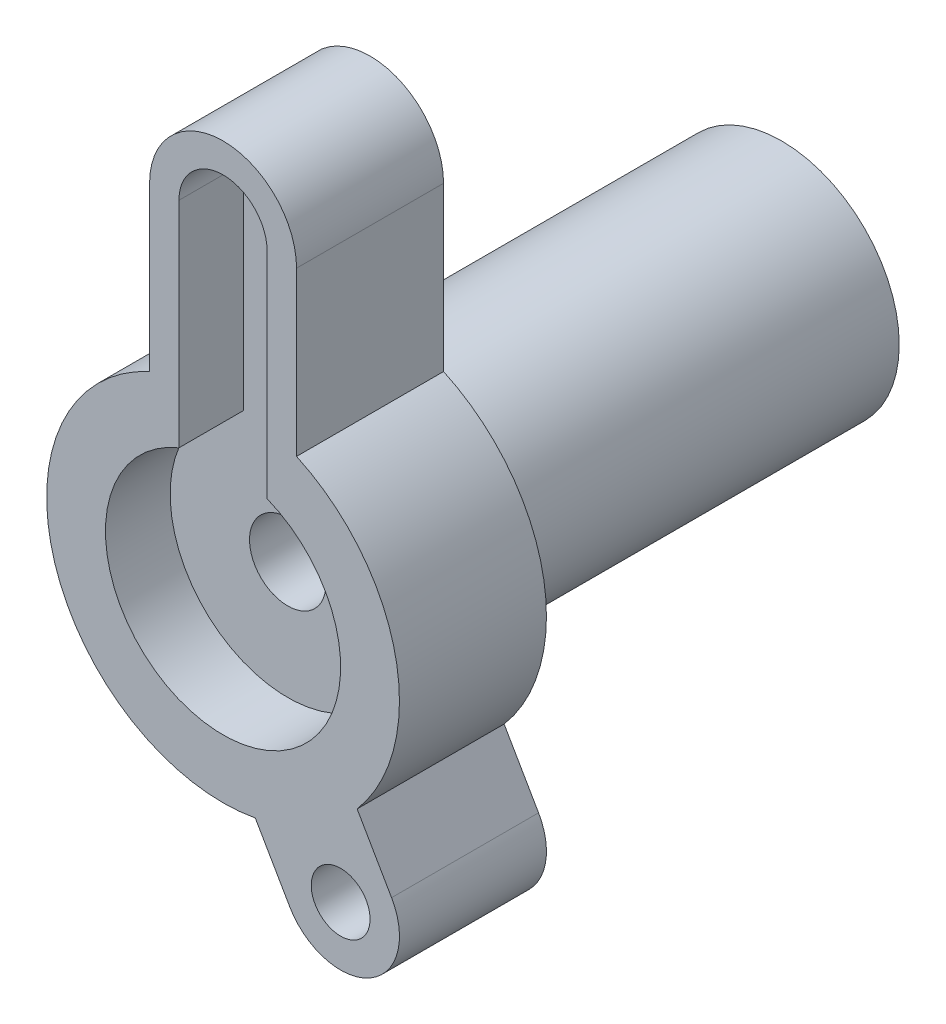
ISO-10303-21;
HEADER;
FILE_DESCRIPTION(('STEP AP214'),'2;1');
FILE_NAME('part.step','',(''),(''),'','','');
FILE_SCHEMA(('AUTOMOTIVE_DESIGN { 1 0 10303 214 1 1 1 1 }'));
ENDSEC;
DATA;
#1=APPLICATION_CONTEXT('core data for automotive mechanical design processes');
#2=APPLICATION_PROTOCOL_DEFINITION('international standard','automotive_design',2000,#1);
#3=PRODUCT_CONTEXT('',#1,'mechanical');
#4=PRODUCT('Part','Part','',(#3));
#5=PRODUCT_RELATED_PRODUCT_CATEGORY('part','',(#4));
#6=PRODUCT_DEFINITION_FORMATION('','',#4);
#7=PRODUCT_DEFINITION_CONTEXT('part definition',#1,'design');
#8=PRODUCT_DEFINITION('design','',#6,#7);
#9=PRODUCT_DEFINITION_SHAPE('','',#8);
#10=(LENGTH_UNIT() NAMED_UNIT(*) SI_UNIT(.MILLI.,.METRE.));
#11=(NAMED_UNIT(*) PLANE_ANGLE_UNIT() SI_UNIT($,.RADIAN.));
#12=(NAMED_UNIT(*) SI_UNIT($,.STERADIAN.) SOLID_ANGLE_UNIT());
#13=UNCERTAINTY_MEASURE_WITH_UNIT(LENGTH_MEASURE(1.E-05),#10,'distance_accuracy_value','');
#14=(GEOMETRIC_REPRESENTATION_CONTEXT(3) GLOBAL_UNCERTAINTY_ASSIGNED_CONTEXT((#13)) GLOBAL_UNIT_ASSIGNED_CONTEXT((#10,
#11,#12)) REPRESENTATION_CONTEXT('',''));
#15=CARTESIAN_POINT('',(0.,0.,0.));
#16=DIRECTION('',(0.,0.,1.));
#17=DIRECTION('',(1.,0.,0.));
#18=AXIS2_PLACEMENT_3D('',#15,#16,#17);
#19=CARTESIAN_POINT('',(0.,0.,71.));
#20=DIRECTION('',(0.,0.,-1.));
#21=DIRECTION('',(-1.,0.,0.));
#22=AXIS2_PLACEMENT_3D('',#19,#20,#21);
#23=CYLINDRICAL_SURFACE('',#22,30.);
#24=DIRECTION('',(0.,0.,1.));
#25=VECTOR('',#24,1.);
#26=CARTESIAN_POINT('',(22.8023896615754,-19.4948974278318,34.8792736773975));
#27=LINE('',#26,#25);
#28=CARTESIAN_POINT('',(22.8023896615754,-19.4948974278318,70.));
#29=VERTEX_POINT('',#28);
#30=CARTESIAN_POINT('',(22.8023896615754,-19.4948974278318,95.));
#31=VERTEX_POINT('',#30);
#32=EDGE_CURVE('E158',#29,#31,#27,.T.);
#33=ORIENTED_EDGE('',*,*,#32,.F.);
#34=CARTESIAN_POINT('',(0.,0.,70.));
#35=DIRECTION('',(0.,0.,1.));
#36=DIRECTION('',(1.,0.,0.));
#37=AXIS2_PLACEMENT_3D('',#34,#35,#36);
#38=CIRCLE('',#37,30.);
#39=CARTESIAN_POINT('',(12.5,27.2717802865893,70.));
#40=VERTEX_POINT('',#39);
#41=EDGE_CURVE('E212',#29,#40,#38,.T.);
#42=ORIENTED_EDGE('',*,*,#41,.T.);
#43=DIRECTION('',(0.,0.,-1.));
#44=VECTOR('',#43,1.);
#45=CARTESIAN_POINT('',(12.5,27.2717802865893,71.));
#46=LINE('',#45,#44);
#47=CARTESIAN_POINT('',(12.5,27.2717802865893,95.));
#48=VERTEX_POINT('',#47);
#49=EDGE_CURVE('E226',#48,#40,#46,.T.);
#50=ORIENTED_EDGE('',*,*,#49,.F.);
#51=CARTESIAN_POINT('',(0.,0.,95.));
#52=DIRECTION('',(0.,0.,1.));
#53=DIRECTION('',(1.,0.,0.));
#54=AXIS2_PLACEMENT_3D('',#51,#52,#53);
#55=CIRCLE('',#54,30.);
#56=EDGE_CURVE('E187',#31,#48,#55,.T.);
#57=ORIENTED_EDGE('',*,*,#56,.F.);
#58=EDGE_LOOP('',(#33,#42,#50,#57));
#59=FACE_BOUND('',#58,.T.);
#60=ADVANCED_FACE('F37',(#59),#23,.T.);
#61=CARTESIAN_POINT('',(0.,0.,0.));
#62=DIRECTION('',(0.,0.,1.));
#63=DIRECTION('',(1.,0.,0.));
#64=AXIS2_PLACEMENT_3D('',#61,#62,#63);
#65=PLANE('',#64);
#66=CARTESIAN_POINT('',(0.,0.,0.));
#67=DIRECTION('',(0.,0.,1.));
#68=DIRECTION('',(1.,0.,0.));
#69=AXIS2_PLACEMENT_3D('',#66,#67,#68);
#70=CIRCLE('',#69,20.);
#71=CARTESIAN_POINT('',(20.,0.,0.));
#72=VERTEX_POINT('',#71);
#73=EDGE_CURVE('E41',#72,#72,#70,.T.);
#74=ORIENTED_EDGE('',*,*,#73,.F.);
#75=EDGE_LOOP('',(#74));
#76=FACE_BOUND('',#75,.T.);
#77=CARTESIAN_POINT('',(0.,0.,0.));
#78=DIRECTION('',(0.,0.,1.));
#79=DIRECTION('',(1.,0.,0.));
#80=AXIS2_PLACEMENT_3D('',#77,#78,#79);
#81=CIRCLE('',#80,6.5);
#82=CARTESIAN_POINT('',(6.5,0.,0.));
#83=VERTEX_POINT('',#82);
#84=EDGE_CURVE('E231',#83,#83,#81,.T.);
#85=ORIENTED_EDGE('',*,*,#84,.T.);
#86=EDGE_LOOP('',(#85));
#87=FACE_BOUND('',#86,.T.);
#88=ADVANCED_FACE('F239',(#76,#87),#65,.F.);
#89=CARTESIAN_POINT('',(0.,0.,70.));
#90=DIRECTION('',(0.,0.,-1.));
#91=DIRECTION('',(-1.,0.,0.));
#92=AXIS2_PLACEMENT_3D('',#89,#90,#91);
#93=CYLINDRICAL_SURFACE('',#92,20.);
#94=CARTESIAN_POINT('',(0.,0.,70.));
#95=DIRECTION('',(0.,0.,1.));
#96=DIRECTION('',(1.,0.,0.));
#97=AXIS2_PLACEMENT_3D('',#94,#95,#96);
#98=CIRCLE('',#97,20.);
#99=CARTESIAN_POINT('',(20.,0.,70.));
#100=VERTEX_POINT('',#99);
#101=EDGE_CURVE('E11',#100,#100,#98,.T.);
#102=ORIENTED_EDGE('',*,*,#101,.F.);
#103=EDGE_LOOP('',(#102));
#104=FACE_BOUND('',#103,.T.);
#105=ORIENTED_EDGE('',*,*,#73,.T.);
#106=EDGE_LOOP('',(#105));
#107=FACE_BOUND('',#106,.T.);
#108=ADVANCED_FACE('F39',(#104,#107),#93,.T.);
#109=CARTESIAN_POINT('',(0.,0.,70.));
#110=DIRECTION('',(0.,0.,-1.));
#111=DIRECTION('',(-1.,0.,0.));
#112=AXIS2_PLACEMENT_3D('',#109,#110,#111);
#113=CYLINDRICAL_SURFACE('',#112,6.5);
#114=ORIENTED_EDGE('',*,*,#84,.F.);
#115=EDGE_LOOP('',(#114));
#116=FACE_BOUND('',#115,.T.);
#117=CARTESIAN_POINT('',(0.,0.,84.));
#118=DIRECTION('',(0.,0.,1.));
#119=DIRECTION('',(1.,0.,0.));
#120=AXIS2_PLACEMENT_3D('',#117,#118,#119);
#121=CIRCLE('',#120,6.5);
#122=CARTESIAN_POINT('',(6.5,0.,84.));
#123=VERTEX_POINT('',#122);
#124=EDGE_CURVE('E148',#123,#123,#121,.T.);
#125=ORIENTED_EDGE('',*,*,#124,.T.);
#126=EDGE_LOOP('',(#125));
#127=FACE_BOUND('',#126,.T.);
#128=ADVANCED_FACE('F245',(#116,#127),#113,.F.);
#129=CARTESIAN_POINT('',(0.,0.,70.));
#130=DIRECTION('',(0.,0.,1.));
#131=DIRECTION('',(1.,0.,0.));
#132=AXIS2_PLACEMENT_3D('',#129,#130,#131);
#133=PLANE('',#132);
#134=ORIENTED_EDGE('',*,*,#101,.T.);
#135=EDGE_LOOP('',(#134));
#136=FACE_BOUND('',#135,.T.);
#137=DIRECTION('',(0.,1.,0.));
#138=VECTOR('',#137,1.);
#139=CARTESIAN_POINT('',(-12.5,0.,70.));
#140=LINE('',#139,#138);
#141=CARTESIAN_POINT('',(-12.5,27.2717802865893,70.));
#142=VERTEX_POINT('',#141);
#143=CARTESIAN_POINT('',(-12.5,55.,70.));
#144=VERTEX_POINT('',#143);
#145=EDGE_CURVE('E209',#142,#144,#140,.T.);
#146=ORIENTED_EDGE('',*,*,#145,.T.);
#147=CARTESIAN_POINT('',(0.,55.,70.));
#148=DIRECTION('',(0.,0.,1.));
#149=DIRECTION('',(1.,0.,0.));
#150=AXIS2_PLACEMENT_3D('',#147,#148,#149);
#151=CIRCLE('',#150,12.5);
#152=CARTESIAN_POINT('',(12.5,55.,70.));
#153=VERTEX_POINT('',#152);
#154=EDGE_CURVE('E218',#153,#144,#151,.T.);
#155=ORIENTED_EDGE('',*,*,#154,.F.);
#156=DIRECTION('',(0.,1.,0.));
#157=VECTOR('',#156,1.);
#158=CARTESIAN_POINT('',(12.5,0.,70.));
#159=LINE('',#158,#157);
#160=EDGE_CURVE('E216',#40,#153,#159,.T.);
#161=ORIENTED_EDGE('',*,*,#160,.F.);
#162=ORIENTED_EDGE('',*,*,#41,.F.);
#163=DIRECTION('',(-0.500000000000001,0.866025403784438,0.));
#164=VECTOR('',#163,1.);
#165=CARTESIAN_POINT('',(8.66025403784437,5.00000000000001,70.));
#166=LINE('',#165,#164);
#167=CARTESIAN_POINT('',(28.6602540378444,-29.6410161513775,70.));
#168=VERTEX_POINT('',#167);
#169=EDGE_CURVE('E178',#168,#29,#166,.T.);
#170=ORIENTED_EDGE('',*,*,#169,.F.);
#171=CARTESIAN_POINT('',(20.0000000000001,-34.6410161513775,70.));
#172=DIRECTION('',(0.,0.,1.));
#173=DIRECTION('',(1.,0.,0.));
#174=AXIS2_PLACEMENT_3D('',#171,#172,#173);
#175=CIRCLE('',#174,9.99999999999998);
#176=CARTESIAN_POINT('',(11.3397459621557,-39.6410161513775,70.));
#177=VERTEX_POINT('',#176);
#178=EDGE_CURVE('E172',#168,#177,#175,.F.);
#179=ORIENTED_EDGE('',*,*,#178,.T.);
#180=DIRECTION('',(-0.500000000000001,0.866025403784438,0.));
#181=VECTOR('',#180,1.);
#182=CARTESIAN_POINT('',(-8.66025403784436,-5.00000000000001,70.));
#183=LINE('',#182,#181);
#184=CARTESIAN_POINT('',(5.48188158588663,-29.4948974278318,70.));
#185=VERTEX_POINT('',#184);
#186=EDGE_CURVE('E162',#177,#185,#183,.T.);
#187=ORIENTED_EDGE('',*,*,#186,.T.);
#188=EDGE_CURVE('E213',#142,#185,#38,.T.);
#189=ORIENTED_EDGE('',*,*,#188,.F.);
#190=EDGE_LOOP('',(#146,#155,#161,#162,#170,#179,#187,#189));
#191=FACE_BOUND('',#190,.T.);
#192=CARTESIAN_POINT('',(20.0000000000001,-34.6410161513775,70.));
#193=DIRECTION('',(0.,0.,1.));
#194=DIRECTION('',(1.,0.,0.));
#195=AXIS2_PLACEMENT_3D('',#192,#193,#194);
#196=CIRCLE('',#195,5.);
#197=CARTESIAN_POINT('',(25.0000000000001,-34.6410161513775,70.));
#198=VERTEX_POINT('',#197);
#199=EDGE_CURVE('E157',#198,#198,#196,.F.);
#200=ORIENTED_EDGE('',*,*,#199,.F.);
#201=EDGE_LOOP('',(#200));
#202=FACE_BOUND('',#201,.T.);
#203=ADVANCED_FACE('F253',(#136,#191,#202),#133,.F.);
#204=CARTESIAN_POINT('',(-12.5,0.,71.));
#205=DIRECTION('',(-1.,0.,0.));
#206=DIRECTION('',(0.,0.,1.));
#207=AXIS2_PLACEMENT_3D('',#204,#205,#206);
#208=PLANE('',#207);
#209=ORIENTED_EDGE('',*,*,#145,.F.);
#210=DIRECTION('',(0.,0.,-1.));
#211=VECTOR('',#210,1.);
#212=CARTESIAN_POINT('',(-12.5,27.2717802865893,71.));
#213=LINE('',#212,#211);
#214=CARTESIAN_POINT('',(-12.5,27.2717802865893,95.));
#215=VERTEX_POINT('',#214);
#216=EDGE_CURVE('E229',#215,#142,#213,.T.);
#217=ORIENTED_EDGE('',*,*,#216,.F.);
#218=DIRECTION('',(0.,1.,0.));
#219=VECTOR('',#218,1.);
#220=CARTESIAN_POINT('',(-12.5,0.,95.));
#221=LINE('',#220,#219);
#222=CARTESIAN_POINT('',(-12.5,55.,95.));
#223=VERTEX_POINT('',#222);
#224=EDGE_CURVE('E174',#215,#223,#221,.T.);
#225=ORIENTED_EDGE('',*,*,#224,.T.);
#226=DIRECTION('',(0.,0.,-1.));
#227=VECTOR('',#226,1.);
#228=CARTESIAN_POINT('',(-12.5,55.,71.));
#229=LINE('',#228,#227);
#230=EDGE_CURVE('E221',#223,#144,#229,.T.);
#231=ORIENTED_EDGE('',*,*,#230,.T.);
#232=EDGE_LOOP('',(#209,#217,#225,#231));
#233=FACE_BOUND('',#232,.T.);
#234=ADVANCED_FACE('F255',(#233),#208,.T.);
#235=ORIENTED_EDGE('',*,*,#188,.T.);
#236=DIRECTION('',(0.,0.,1.));
#237=VECTOR('',#236,1.);
#238=CARTESIAN_POINT('',(5.48188158588663,-29.4948974278318,34.8792736773975));
#239=LINE('',#238,#237);
#240=CARTESIAN_POINT('',(5.48188158588663,-29.4948974278318,95.));
#241=VERTEX_POINT('',#240);
#242=EDGE_CURVE('E175',#185,#241,#239,.T.);
#243=ORIENTED_EDGE('',*,*,#242,.T.);
#244=EDGE_CURVE('E188',#215,#241,#55,.T.);
#245=ORIENTED_EDGE('',*,*,#244,.F.);
#246=ORIENTED_EDGE('',*,*,#216,.T.);
#247=EDGE_LOOP('',(#235,#243,#245,#246));
#248=FACE_BOUND('',#247,.T.);
#249=ADVANCED_FACE('F249',(#248),#23,.T.);
#250=CARTESIAN_POINT('',(12.5,0.,71.));
#251=DIRECTION('',(-1.,0.,0.));
#252=DIRECTION('',(0.,0.,1.));
#253=AXIS2_PLACEMENT_3D('',#250,#251,#252);
#254=PLANE('',#253);
#255=ORIENTED_EDGE('',*,*,#160,.T.);
#256=DIRECTION('',(0.,0.,-1.));
#257=VECTOR('',#256,1.);
#258=CARTESIAN_POINT('',(12.5,55.,71.));
#259=LINE('',#258,#257);
#260=CARTESIAN_POINT('',(12.5,55.,95.));
#261=VERTEX_POINT('',#260);
#262=EDGE_CURVE('E223',#261,#153,#259,.T.);
#263=ORIENTED_EDGE('',*,*,#262,.F.);
#264=DIRECTION('',(0.,1.,0.));
#265=VECTOR('',#264,1.);
#266=CARTESIAN_POINT('',(12.5,0.,95.));
#267=LINE('',#266,#265);
#268=EDGE_CURVE('E191',#48,#261,#267,.T.);
#269=ORIENTED_EDGE('',*,*,#268,.F.);
#270=ORIENTED_EDGE('',*,*,#49,.T.);
#271=EDGE_LOOP('',(#255,#263,#269,#270));
#272=FACE_BOUND('',#271,.T.);
#273=ADVANCED_FACE('F260',(#272),#254,.F.);
#274=CARTESIAN_POINT('',(0.,55.,71.));
#275=DIRECTION('',(0.,0.,-1.));
#276=DIRECTION('',(-1.,0.,0.));
#277=AXIS2_PLACEMENT_3D('',#274,#275,#276);
#278=CYLINDRICAL_SURFACE('',#277,12.5);
#279=ORIENTED_EDGE('',*,*,#154,.T.);
#280=ORIENTED_EDGE('',*,*,#230,.F.);
#281=CARTESIAN_POINT('',(0.,55.,95.));
#282=DIRECTION('',(0.,0.,1.));
#283=DIRECTION('',(1.,0.,0.));
#284=AXIS2_PLACEMENT_3D('',#281,#282,#283);
#285=CIRCLE('',#284,12.5);
#286=EDGE_CURVE('E194',#261,#223,#285,.T.);
#287=ORIENTED_EDGE('',*,*,#286,.F.);
#288=ORIENTED_EDGE('',*,*,#262,.T.);
#289=EDGE_LOOP('',(#279,#280,#287,#288));
#290=FACE_BOUND('',#289,.T.);
#291=ADVANCED_FACE('F264',(#290),#278,.T.);
#292=CARTESIAN_POINT('',(0.,0.,95.));
#293=DIRECTION('',(0.,0.,-1.));
#294=DIRECTION('',(-1.,0.,0.));
#295=AXIS2_PLACEMENT_3D('',#292,#293,#294);
#296=CYLINDRICAL_SURFACE('',#295,20.);
#297=CARTESIAN_POINT('',(0.,0.,84.));
#298=DIRECTION('',(0.,0.,1.));
#299=DIRECTION('',(1.,0.,0.));
#300=AXIS2_PLACEMENT_3D('',#297,#298,#299);
#301=CIRCLE('',#300,20.);
#302=CARTESIAN_POINT('',(-7.5,18.5404962177392,84.));
#303=VERTEX_POINT('',#302);
#304=CARTESIAN_POINT('',(7.5,18.5404962177392,84.));
#305=VERTEX_POINT('',#304);
#306=EDGE_CURVE('E52',#303,#305,#301,.T.);
#307=ORIENTED_EDGE('',*,*,#306,.F.);
#308=DIRECTION('',(0.,0.,-1.));
#309=VECTOR('',#308,1.);
#310=CARTESIAN_POINT('',(-7.5,18.5404962177392,95.));
#311=LINE('',#310,#309);
#312=CARTESIAN_POINT('',(-7.5,18.5404962177392,95.));
#313=VERTEX_POINT('',#312);
#314=EDGE_CURVE('E207',#313,#303,#311,.T.);
#315=ORIENTED_EDGE('',*,*,#314,.F.);
#316=CARTESIAN_POINT('',(0.,0.,95.));
#317=DIRECTION('',(0.,0.,1.));
#318=DIRECTION('',(1.,0.,0.));
#319=AXIS2_PLACEMENT_3D('',#316,#317,#318);
#320=CIRCLE('',#319,20.);
#321=CARTESIAN_POINT('',(7.5,18.5404962177392,95.));
#322=VERTEX_POINT('',#321);
#323=EDGE_CURVE('E197',#313,#322,#320,.T.);
#324=ORIENTED_EDGE('',*,*,#323,.T.);
#325=DIRECTION('',(0.,0.,-1.));
#326=VECTOR('',#325,1.);
#327=CARTESIAN_POINT('',(7.5,18.5404962177392,95.));
#328=LINE('',#327,#326);
#329=EDGE_CURVE('E138',#322,#305,#328,.T.);
#330=ORIENTED_EDGE('',*,*,#329,.T.);
#331=EDGE_LOOP('',(#307,#315,#324,#330));
#332=FACE_BOUND('',#331,.T.);
#333=ADVANCED_FACE('F268',(#332),#296,.F.);
#334=CARTESIAN_POINT('',(-7.5,0.,95.));
#335=DIRECTION('',(-1.,0.,0.));
#336=DIRECTION('',(0.,0.,1.));
#337=AXIS2_PLACEMENT_3D('',#334,#335,#336);
#338=PLANE('',#337);
#339=ORIENTED_EDGE('',*,*,#314,.T.);
#340=DIRECTION('',(0.,-1.,0.));
#341=VECTOR('',#340,1.);
#342=CARTESIAN_POINT('',(-7.5,55.,84.));
#343=LINE('',#342,#341);
#344=CARTESIAN_POINT('',(-7.5,55.,84.));
#345=VERTEX_POINT('',#344);
#346=EDGE_CURVE('E59',#345,#303,#343,.T.);
#347=ORIENTED_EDGE('',*,*,#346,.F.);
#348=DIRECTION('',(0.,0.,-1.));
#349=VECTOR('',#348,1.);
#350=CARTESIAN_POINT('',(-7.5,55.,95.));
#351=LINE('',#350,#349);
#352=CARTESIAN_POINT('',(-7.5,55.,95.));
#353=VERTEX_POINT('',#352);
#354=EDGE_CURVE('E137',#353,#345,#351,.T.);
#355=ORIENTED_EDGE('',*,*,#354,.F.);
#356=DIRECTION('',(0.,1.,0.));
#357=VECTOR('',#356,1.);
#358=CARTESIAN_POINT('',(-7.5,0.,95.));
#359=LINE('',#358,#357);
#360=EDGE_CURVE('E200',#313,#353,#359,.T.);
#361=ORIENTED_EDGE('',*,*,#360,.F.);
#362=EDGE_LOOP('',(#339,#347,#355,#361));
#363=FACE_BOUND('',#362,.T.);
#364=ADVANCED_FACE('F275',(#363),#338,.F.);
#365=CARTESIAN_POINT('',(0.,55.,95.));
#366=DIRECTION('',(0.,0.,-1.));
#367=DIRECTION('',(-1.,0.,0.));
#368=AXIS2_PLACEMENT_3D('',#365,#366,#367);
#369=CYLINDRICAL_SURFACE('',#368,7.5);
#370=CARTESIAN_POINT('',(0.,55.,84.));
#371=DIRECTION('',(0.,0.,1.));
#372=DIRECTION('',(1.,0.,0.));
#373=AXIS2_PLACEMENT_3D('',#370,#371,#372);
#374=CIRCLE('',#373,7.5);
#375=CARTESIAN_POINT('',(7.5,55.,84.));
#376=VERTEX_POINT('',#375);
#377=EDGE_CURVE('E141',#376,#345,#374,.T.);
#378=ORIENTED_EDGE('',*,*,#377,.F.);
#379=DIRECTION('',(0.,0.,-1.));
#380=VECTOR('',#379,1.);
#381=CARTESIAN_POINT('',(7.5,55.,95.));
#382=LINE('',#381,#380);
#383=CARTESIAN_POINT('',(7.5,55.,95.));
#384=VERTEX_POINT('',#383);
#385=EDGE_CURVE('E127',#384,#376,#382,.T.);
#386=ORIENTED_EDGE('',*,*,#385,.F.);
#387=CARTESIAN_POINT('',(0.,55.,95.));
#388=DIRECTION('',(0.,0.,1.));
#389=DIRECTION('',(1.,0.,0.));
#390=AXIS2_PLACEMENT_3D('',#387,#388,#389);
#391=CIRCLE('',#390,7.5);
#392=EDGE_CURVE('E202',#384,#353,#391,.T.);
#393=ORIENTED_EDGE('',*,*,#392,.T.);
#394=ORIENTED_EDGE('',*,*,#354,.T.);
#395=EDGE_LOOP('',(#378,#386,#393,#394));
#396=FACE_BOUND('',#395,.T.);
#397=ADVANCED_FACE('F142',(#396),#369,.F.);
#398=CARTESIAN_POINT('',(7.5,0.,95.));
#399=DIRECTION('',(-1.,0.,0.));
#400=DIRECTION('',(0.,-1.,0.));
#401=AXIS2_PLACEMENT_3D('',#398,#399,#400);
#402=PLANE('',#401);
#403=DIRECTION('',(0.,1.,0.));
#404=VECTOR('',#403,1.);
#405=CARTESIAN_POINT('',(7.5,18.5404962177392,84.));
#406=LINE('',#405,#404);
#407=EDGE_CURVE('E131',#305,#376,#406,.T.);
#408=ORIENTED_EDGE('',*,*,#407,.F.);
#409=ORIENTED_EDGE('',*,*,#329,.F.);
#410=DIRECTION('',(0.,1.,0.));
#411=VECTOR('',#410,1.);
#412=CARTESIAN_POINT('',(7.5,0.,95.));
#413=LINE('',#412,#411);
#414=EDGE_CURVE('E133',#322,#384,#413,.T.);
#415=ORIENTED_EDGE('',*,*,#414,.T.);
#416=ORIENTED_EDGE('',*,*,#385,.T.);
#417=EDGE_LOOP('',(#408,#409,#415,#416));
#418=FACE_BOUND('',#417,.T.);
#419=ADVANCED_FACE('F129',(#418),#402,.T.);
#420=CARTESIAN_POINT('',(0.,0.,95.));
#421=DIRECTION('',(0.,0.,1.));
#422=DIRECTION('',(1.,0.,0.));
#423=AXIS2_PLACEMENT_3D('',#420,#421,#422);
#424=PLANE('',#423);
#425=ORIENTED_EDGE('',*,*,#224,.F.);
#426=ORIENTED_EDGE('',*,*,#244,.T.);
#427=DIRECTION('',(0.500000000000001,-0.866025403784438,0.));
#428=VECTOR('',#427,1.);
#429=CARTESIAN_POINT('',(-8.66025403784436,-5.00000000000001,95.));
#430=LINE('',#429,#428);
#431=CARTESIAN_POINT('',(11.3397459621557,-39.6410161513775,95.));
#432=VERTEX_POINT('',#431);
#433=EDGE_CURVE('E163',#241,#432,#430,.T.);
#434=ORIENTED_EDGE('',*,*,#433,.T.);
#435=CARTESIAN_POINT('',(20.0000000000001,-34.6410161513775,95.));
#436=DIRECTION('',(0.,0.,1.));
#437=DIRECTION('',(1.,0.,0.));
#438=AXIS2_PLACEMENT_3D('',#435,#436,#437);
#439=CIRCLE('',#438,9.99999999999998);
#440=CARTESIAN_POINT('',(28.6602540378444,-29.6410161513775,95.));
#441=VERTEX_POINT('',#440);
#442=EDGE_CURVE('E159',#432,#441,#439,.T.);
#443=ORIENTED_EDGE('',*,*,#442,.T.);
#444=DIRECTION('',(0.500000000000001,-0.866025403784438,0.));
#445=VECTOR('',#444,1.);
#446=CARTESIAN_POINT('',(8.66025403784437,5.00000000000001,95.));
#447=LINE('',#446,#445);
#448=EDGE_CURVE('E154',#31,#441,#447,.T.);
#449=ORIENTED_EDGE('',*,*,#448,.F.);
#450=ORIENTED_EDGE('',*,*,#56,.T.);
#451=ORIENTED_EDGE('',*,*,#268,.T.);
#452=ORIENTED_EDGE('',*,*,#286,.T.);
#453=EDGE_LOOP('',(#425,#426,#434,#443,#449,#450,#451,#452));
#454=FACE_BOUND('',#453,.T.);
#455=ORIENTED_EDGE('',*,*,#323,.F.);
#456=ORIENTED_EDGE('',*,*,#360,.T.);
#457=ORIENTED_EDGE('',*,*,#392,.F.);
#458=ORIENTED_EDGE('',*,*,#414,.F.);
#459=EDGE_LOOP('',(#455,#456,#457,#458));
#460=FACE_BOUND('',#459,.T.);
#461=CARTESIAN_POINT('',(20.0000000000001,-34.6410161513775,95.));
#462=DIRECTION('',(0.,0.,1.));
#463=DIRECTION('',(1.,0.,0.));
#464=AXIS2_PLACEMENT_3D('',#461,#462,#463);
#465=CIRCLE('',#464,5.);
#466=CARTESIAN_POINT('',(25.0000000000001,-34.6410161513775,95.));
#467=VERTEX_POINT('',#466);
#468=EDGE_CURVE('E167',#467,#467,#465,.T.);
#469=ORIENTED_EDGE('',*,*,#468,.F.);
#470=EDGE_LOOP('',(#469));
#471=FACE_BOUND('',#470,.T.);
#472=ADVANCED_FACE('F282',(#454,#460,#471),#424,.T.);
#473=CARTESIAN_POINT('',(-8.66025403784436,-5.00000000000001,34.8792736773975));
#474=DIRECTION('',(-0.866025403784438,-0.500000000000001,0.));
#475=DIRECTION('',(0.500000000000001,-0.866025403784438,0.));
#476=AXIS2_PLACEMENT_3D('',#473,#474,#475);
#477=PLANE('',#476);
#478=ORIENTED_EDGE('',*,*,#186,.F.);
#479=DIRECTION('',(0.,0.,1.));
#480=VECTOR('',#479,1.);
#481=CARTESIAN_POINT('',(11.3397459621557,-39.6410161513775,34.8792736773975));
#482=LINE('',#481,#480);
#483=EDGE_CURVE('E153',#177,#432,#482,.T.);
#484=ORIENTED_EDGE('',*,*,#483,.T.);
#485=ORIENTED_EDGE('',*,*,#433,.F.);
#486=ORIENTED_EDGE('',*,*,#242,.F.);
#487=EDGE_LOOP('',(#478,#484,#485,#486));
#488=FACE_BOUND('',#487,.T.);
#489=ADVANCED_FACE('F285',(#488),#477,.T.);
#490=CARTESIAN_POINT('',(8.66025403784437,5.00000000000001,34.8792736773975));
#491=DIRECTION('',(-0.866025403784438,-0.500000000000001,0.));
#492=DIRECTION('',(0.500000000000001,-0.866025403784438,0.));
#493=AXIS2_PLACEMENT_3D('',#490,#491,#492);
#494=PLANE('',#493);
#495=DIRECTION('',(0.,0.,1.));
#496=VECTOR('',#495,1.);
#497=CARTESIAN_POINT('',(28.6602540378444,-29.6410161513775,34.8792736773975));
#498=LINE('',#497,#496);
#499=EDGE_CURVE('E166',#168,#441,#498,.T.);
#500=ORIENTED_EDGE('',*,*,#499,.F.);
#501=ORIENTED_EDGE('',*,*,#169,.T.);
#502=ORIENTED_EDGE('',*,*,#32,.T.);
#503=ORIENTED_EDGE('',*,*,#448,.T.);
#504=EDGE_LOOP('',(#500,#501,#502,#503));
#505=FACE_BOUND('',#504,.T.);
#506=ADVANCED_FACE('F289',(#505),#494,.F.);
#507=CARTESIAN_POINT('',(20.0000000000001,-34.6410161513775,34.8792736773975));
#508=DIRECTION('',(0.,0.,1.));
#509=DIRECTION('',(1.,0.,0.));
#510=AXIS2_PLACEMENT_3D('',#507,#508,#509);
#511=CYLINDRICAL_SURFACE('',#510,5.);
#512=ORIENTED_EDGE('',*,*,#199,.T.);
#513=EDGE_LOOP('',(#512));
#514=FACE_BOUND('',#513,.T.);
#515=ORIENTED_EDGE('',*,*,#468,.T.);
#516=EDGE_LOOP('',(#515));
#517=FACE_BOUND('',#516,.T.);
#518=ADVANCED_FACE('F293',(#514,#517),#511,.F.);
#519=CARTESIAN_POINT('',(20.0000000000001,-34.6410161513775,34.8792736773975));
#520=DIRECTION('',(0.,0.,1.));
#521=DIRECTION('',(1.,0.,0.));
#522=AXIS2_PLACEMENT_3D('',#519,#520,#521);
#523=CYLINDRICAL_SURFACE('',#522,9.99999999999998);
#524=ORIENTED_EDGE('',*,*,#178,.F.);
#525=ORIENTED_EDGE('',*,*,#499,.T.);
#526=ORIENTED_EDGE('',*,*,#442,.F.);
#527=ORIENTED_EDGE('',*,*,#483,.F.);
#528=EDGE_LOOP('',(#524,#525,#526,#527));
#529=FACE_BOUND('',#528,.T.);
#530=ADVANCED_FACE('F295',(#529),#523,.T.);
#531=CARTESIAN_POINT('',(0.,0.,84.));
#532=DIRECTION('',(0.,0.,1.));
#533=DIRECTION('',(1.,0.,0.));
#534=AXIS2_PLACEMENT_3D('',#531,#532,#533);
#535=PLANE('',#534);
#536=ORIENTED_EDGE('',*,*,#306,.T.);
#537=ORIENTED_EDGE('',*,*,#407,.T.);
#538=ORIENTED_EDGE('',*,*,#377,.T.);
#539=ORIENTED_EDGE('',*,*,#346,.T.);
#540=EDGE_LOOP('',(#536,#537,#538,#539));
#541=FACE_BOUND('',#540,.T.);
#542=ORIENTED_EDGE('',*,*,#124,.F.);
#543=EDGE_LOOP('',(#542));
#544=FACE_BOUND('',#543,.T.);
#545=ADVANCED_FACE('F145',(#541,#544),#535,.T.);
#546=CLOSED_SHELL('',(#60,#88,#108,#128,#203,#234,#249,#273,#291,#333,#364,#397,#419,#472,#489,
#506,#518,#530,#545));
#547=MANIFOLD_SOLID_BREP('B2',#546);
#548=ADVANCED_BREP_SHAPE_REPRESENTATION('',(#18,#547),#14);
#549=SHAPE_DEFINITION_REPRESENTATION(#9,#548);
ENDSEC;
END-ISO-10303-21;
